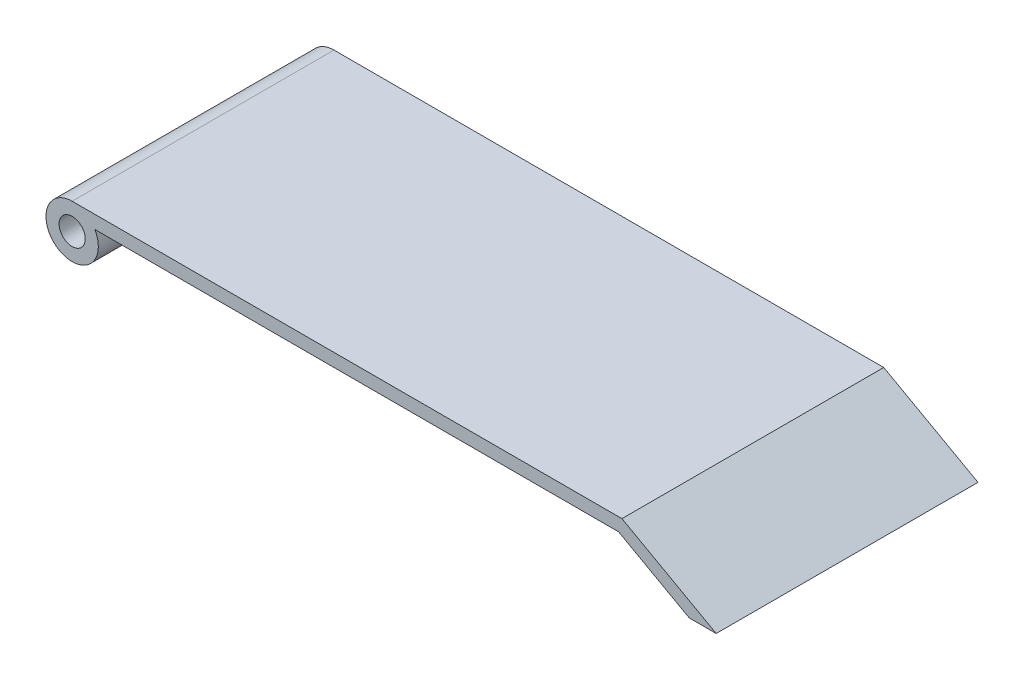
ISO-10303-21;
HEADER;
FILE_DESCRIPTION(('STEP AP214'),'2;1');
FILE_NAME('part.step','',(''),(''),'','','');
FILE_SCHEMA(('AUTOMOTIVE_DESIGN { 1 0 10303 214 1 1 1 1 }'));
ENDSEC;
DATA;
#1=APPLICATION_CONTEXT('core data for automotive mechanical design processes');
#2=APPLICATION_PROTOCOL_DEFINITION('international standard','automotive_design',2000,#1);
#3=PRODUCT_CONTEXT('',#1,'mechanical');
#4=PRODUCT('Part','Part','',(#3));
#5=PRODUCT_RELATED_PRODUCT_CATEGORY('part','',(#4));
#6=PRODUCT_DEFINITION_FORMATION('','',#4);
#7=PRODUCT_DEFINITION_CONTEXT('part definition',#1,'design');
#8=PRODUCT_DEFINITION('design','',#6,#7);
#9=PRODUCT_DEFINITION_SHAPE('','',#8);
#10=(LENGTH_UNIT() NAMED_UNIT(*) SI_UNIT(.MILLI.,.METRE.));
#11=(NAMED_UNIT(*) PLANE_ANGLE_UNIT() SI_UNIT($,.RADIAN.));
#12=(NAMED_UNIT(*) SI_UNIT($,.STERADIAN.) SOLID_ANGLE_UNIT());
#13=UNCERTAINTY_MEASURE_WITH_UNIT(LENGTH_MEASURE(1.E-05),#10,'distance_accuracy_value','');
#14=(GEOMETRIC_REPRESENTATION_CONTEXT(3) GLOBAL_UNCERTAINTY_ASSIGNED_CONTEXT((#13)) GLOBAL_UNIT_ASSIGNED_CONTEXT((#10,
#11,#12)) REPRESENTATION_CONTEXT('',''));
#15=CARTESIAN_POINT('',(0.,0.,0.));
#16=DIRECTION('',(0.,0.,1.));
#17=DIRECTION('',(1.,0.,0.));
#18=AXIS2_PLACEMENT_3D('',#15,#16,#17);
#19=CARTESIAN_POINT('',(10.3363442521382,-10.,10.));
#20=DIRECTION('',(0.,0.,1.));
#21=DIRECTION('',(1.,0.,0.));
#22=AXIS2_PLACEMENT_3D('',#19,#20,#21);
#23=PLANE('',#22);
#24=CARTESIAN_POINT('',(10.3363442521382,-10.,10.));
#25=DIRECTION('',(0.,0.,-1.));
#26=DIRECTION('',(1.,0.,0.));
#27=AXIS2_PLACEMENT_3D('',#24,#25,#26);
#28=CIRCLE('',#27,2.4);
#29=CARTESIAN_POINT('',(7.93634425213825,-10.,10.));
#30=VERTEX_POINT('',#29);
#31=EDGE_CURVE('P0_E21',#30,#30,#28,.T.);
#32=ORIENTED_EDGE('',*,*,#31,.F.);
#33=EDGE_LOOP('',(#32));
#34=FACE_BOUND('',#33,.T.);
#35=ADVANCED_FACE('P0_F17',(#34),#23,.T.);
#36=CARTESIAN_POINT('',(10.3363442521382,-10.,0.));
#37=DIRECTION('',(0.,0.,1.));
#38=DIRECTION('',(1.,0.,0.));
#39=AXIS2_PLACEMENT_3D('',#36,#37,#38);
#40=PLANE('',#39);
#41=CARTESIAN_POINT('',(10.3363442521382,-10.,0.));
#42=DIRECTION('',(0.,0.,1.));
#43=DIRECTION('',(1.,0.,0.));
#44=AXIS2_PLACEMENT_3D('',#41,#42,#43);
#45=CIRCLE('',#44,2.4);
#46=CARTESIAN_POINT('',(7.93634425213825,-10.,0.));
#47=VERTEX_POINT('',#46);
#48=EDGE_CURVE('P0_E11',#47,#47,#45,.T.);
#49=ORIENTED_EDGE('',*,*,#48,.F.);
#50=EDGE_LOOP('',(#49));
#51=FACE_BOUND('',#50,.T.);
#52=ADVANCED_FACE('P0_F19',(#51),#40,.F.);
#53=CARTESIAN_POINT('',(10.3363442521382,-10.,0.));
#54=DIRECTION('',(0.,0.,1.));
#55=DIRECTION('',(1.,0.,0.));
#56=AXIS2_PLACEMENT_3D('',#53,#54,#55);
#57=CYLINDRICAL_SURFACE('',#56,2.4);
#58=ORIENTED_EDGE('',*,*,#48,.T.);
#59=EDGE_LOOP('',(#58));
#60=FACE_BOUND('',#59,.T.);
#61=ORIENTED_EDGE('',*,*,#31,.T.);
#62=EDGE_LOOP('',(#61));
#63=FACE_BOUND('',#62,.T.);
#64=ADVANCED_FACE('P0_F40',(#60,#63),#57,.T.);
#65=CLOSED_SHELL('',(#35,#52,#64));
#66=MANIFOLD_SOLID_BREP('P0_B1',#65);
#67=CARTESIAN_POINT('',(59.,0.,50.));
#68=DIRECTION('',(0.,0.,1.));
#69=DIRECTION('',(1.,0.,0.));
#70=AXIS2_PLACEMENT_3D('',#67,#68,#69);
#71=PLANE('',#70);
#72=CARTESIAN_POINT('',(0.,0.,50.));
#73=DIRECTION('',(0.,0.,-1.));
#74=DIRECTION('',(-1.,0.,0.));
#75=AXIS2_PLACEMENT_3D('',#72,#73,#74);
#76=CIRCLE('',#75,2.5);
#77=CARTESIAN_POINT('',(2.5,0.,50.));
#78=VERTEX_POINT('',#77);
#79=EDGE_CURVE('P1_E10',#78,#78,#76,.T.);
#80=ORIENTED_EDGE('',*,*,#79,.T.);
#81=EDGE_LOOP('',(#80));
#82=FACE_BOUND('',#81,.T.);
#83=DIRECTION('',(0.87415727612154,-0.485642931178628,0.));
#84=VECTOR('',#83,1.);
#85=CARTESIAN_POINT('',(104.352184929506,2.5,50.));
#86=LINE('',#85,#84);
#87=CARTESIAN_POINT('',(104.352184929506,2.5,50.));
#88=VERTEX_POINT('',#87);
#89=CARTESIAN_POINT('',(117.852184929507,-5.,50.));
#90=VERTEX_POINT('',#89);
#91=EDGE_CURVE('P1_E216',#88,#90,#86,.T.);
#92=ORIENTED_EDGE('',*,*,#91,.T.);
#93=DIRECTION('',(-1.,0.,0.));
#94=VECTOR('',#93,1.);
#95=CARTESIAN_POINT('',(123.,-5.,50.));
#96=LINE('',#95,#94);
#97=CARTESIAN_POINT('',(123.,-5.,50.));
#98=VERTEX_POINT('',#97);
#99=EDGE_CURVE('P1_E241',#98,#90,#96,.T.);
#100=ORIENTED_EDGE('',*,*,#99,.F.);
#101=DIRECTION('',(-0.874157276121538,0.485642931178632,0.));
#102=VECTOR('',#101,1.);
#103=CARTESIAN_POINT('',(123.,-5.,50.));
#104=LINE('',#103,#102);
#105=CARTESIAN_POINT('',(105.,5.,50.));
#106=VERTEX_POINT('',#105);
#107=EDGE_CURVE('P1_E180',#98,#106,#104,.T.);
#108=ORIENTED_EDGE('',*,*,#107,.T.);
#109=DIRECTION('',(1.,0.,0.));
#110=VECTOR('',#109,1.);
#111=CARTESIAN_POINT('',(0.,5.,50.));
#112=LINE('',#111,#110);
#113=CARTESIAN_POINT('',(0.,5.,50.));
#114=VERTEX_POINT('',#113);
#115=EDGE_CURVE('P1_E177',#114,#106,#112,.T.);
#116=ORIENTED_EDGE('',*,*,#115,.F.);
#117=CARTESIAN_POINT('',(0.,0.,50.));
#118=DIRECTION('',(0.,0.,-1.));
#119=DIRECTION('',(-0.707106781186548,0.707106781186548,0.));
#120=AXIS2_PLACEMENT_3D('',#117,#118,#119);
#121=CIRCLE('',#120,5.);
#122=CARTESIAN_POINT('',(4.3301270189222,2.5,50.));
#123=VERTEX_POINT('',#122);
#124=EDGE_CURVE('P1_E162',#123,#114,#121,.T.);
#125=ORIENTED_EDGE('',*,*,#124,.F.);
#126=DIRECTION('',(1.,0.,0.));
#127=VECTOR('',#126,1.);
#128=CARTESIAN_POINT('',(4.3301270189222,2.5,50.));
#129=LINE('',#128,#127);
#130=EDGE_CURVE('P1_E231',#123,#88,#129,.T.);
#131=ORIENTED_EDGE('',*,*,#130,.T.);
#132=EDGE_LOOP('',(#92,#100,#108,#116,#125,#131));
#133=FACE_BOUND('',#132,.T.);
#134=ADVANCED_FACE('P1_F16',(#82,#133),#71,.T.);
#135=CARTESIAN_POINT('',(0.,0.,0.));
#136=DIRECTION('',(0.,0.,1.));
#137=DIRECTION('',(-1.,0.,0.));
#138=AXIS2_PLACEMENT_3D('',#135,#136,#137);
#139=CYLINDRICAL_SURFACE('',#138,2.5);
#140=CARTESIAN_POINT('',(0.,0.,0.));
#141=DIRECTION('',(0.,0.,1.));
#142=DIRECTION('',(-1.,0.,0.));
#143=AXIS2_PLACEMENT_3D('',#140,#141,#142);
#144=CIRCLE('',#143,2.5);
#145=CARTESIAN_POINT('',(2.5,0.,0.));
#146=VERTEX_POINT('',#145);
#147=EDGE_CURVE('P1_E287',#146,#146,#144,.T.);
#148=ORIENTED_EDGE('',*,*,#147,.F.);
#149=EDGE_LOOP('',(#148));
#150=FACE_BOUND('',#149,.T.);
#151=ORIENTED_EDGE('',*,*,#79,.F.);
#152=EDGE_LOOP('',(#151));
#153=FACE_BOUND('',#152,.T.);
#154=ADVANCED_FACE('P1_F371',(#150,#153),#139,.F.);
#155=CARTESIAN_POINT('',(10.3363442521382,-10.,5.));
#156=DIRECTION('',(0.,0.,1.));
#157=DIRECTION('',(1.,0.,0.));
#158=AXIS2_PLACEMENT_3D('',#155,#156,#157);
#159=PLANE('',#158);
#160=CARTESIAN_POINT('',(10.3363442521382,-10.,5.));
#161=DIRECTION('',(0.,0.,-1.));
#162=DIRECTION('',(1.,0.,0.));
#163=AXIS2_PLACEMENT_3D('',#160,#161,#162);
#164=CIRCLE('',#163,2.5);
#165=CARTESIAN_POINT('',(7.83634425213825,-10.,5.));
#166=VERTEX_POINT('',#165);
#167=EDGE_CURVE('P1_E203',#166,#166,#164,.T.);
#168=ORIENTED_EDGE('',*,*,#167,.T.);
#169=EDGE_LOOP('',(#168));
#170=FACE_BOUND('',#169,.T.);
#171=CARTESIAN_POINT('',(10.3363442521382,-10.,5.));
#172=DIRECTION('',(0.,0.,-1.));
#173=DIRECTION('',(-0.707106781186548,-0.707106781186547,0.));
#174=AXIS2_PLACEMENT_3D('',#171,#172,#173);
#175=CIRCLE('',#174,5.);
#176=CARTESIAN_POINT('',(15.3363442521383,-10.,5.));
#177=VERTEX_POINT('',#176);
#178=CARTESIAN_POINT('',(5.33634425213825,-10.,5.));
#179=VERTEX_POINT('',#178);
#180=EDGE_CURVE('P1_E173',#177,#179,#175,.T.);
#181=ORIENTED_EDGE('',*,*,#180,.F.);
#182=DIRECTION('',(0.,-1.,0.));
#183=VECTOR('',#182,1.);
#184=CARTESIAN_POINT('',(15.3363442521383,2.5,5.));
#185=LINE('',#184,#183);
#186=CARTESIAN_POINT('',(15.3363442521383,2.5,5.));
#187=VERTEX_POINT('',#186);
#188=EDGE_CURVE('P1_E20',#187,#177,#185,.T.);
#189=ORIENTED_EDGE('',*,*,#188,.F.);
#190=DIRECTION('',(1.,0.,0.));
#191=VECTOR('',#190,1.);
#192=CARTESIAN_POINT('',(5.33634425213824,2.5,5.));
#193=LINE('',#192,#191);
#194=CARTESIAN_POINT('',(5.33634425213824,2.5,5.));
#195=VERTEX_POINT('',#194);
#196=EDGE_CURVE('P1_E244',#195,#187,#193,.T.);
#197=ORIENTED_EDGE('',*,*,#196,.F.);
#198=DIRECTION('',(0.,1.,0.));
#199=VECTOR('',#198,1.);
#200=CARTESIAN_POINT('',(5.33634425213825,-10.,5.));
#201=LINE('',#200,#199);
#202=EDGE_CURVE('P1_E27',#179,#195,#201,.T.);
#203=ORIENTED_EDGE('',*,*,#202,.F.);
#204=EDGE_LOOP('',(#181,#189,#197,#203));
#205=FACE_BOUND('',#204,.T.);
#206=ADVANCED_FACE('P1_F18',(#170,#205),#159,.T.);
#207=CARTESIAN_POINT('',(5.33634425213825,-15.,0.));
#208=DIRECTION('',(-1.,0.,0.));
#209=DIRECTION('',(0.,0.,1.));
#210=AXIS2_PLACEMENT_3D('',#207,#208,#209);
#211=PLANE('',#210);
#212=DIRECTION('',(0.,0.,-1.));
#213=VECTOR('',#212,1.);
#214=CARTESIAN_POINT('',(5.33634425213825,-10.,5.));
#215=LINE('',#214,#213);
#216=CARTESIAN_POINT('',(5.33634425213825,-10.,0.));
#217=VERTEX_POINT('',#216);
#218=EDGE_CURVE('P1_E303',#179,#217,#215,.T.);
#219=ORIENTED_EDGE('',*,*,#218,.F.);
#220=ORIENTED_EDGE('',*,*,#202,.T.);
#221=DIRECTION('',(0.,0.,1.));
#222=VECTOR('',#221,1.);
#223=CARTESIAN_POINT('',(5.33634425213824,2.5,2.5));
#224=LINE('',#223,#222);
#225=CARTESIAN_POINT('',(5.33634425213824,2.5,2.5));
#226=VERTEX_POINT('',#225);
#227=EDGE_CURVE('P1_E230',#226,#195,#224,.T.);
#228=ORIENTED_EDGE('',*,*,#227,.F.);
#229=DIRECTION('',(0.,1.,0.));
#230=VECTOR('',#229,1.);
#231=CARTESIAN_POINT('',(5.33634425213824,-5.,2.5));
#232=LINE('',#231,#230);
#233=CARTESIAN_POINT('',(5.33634425213824,-5.,2.5));
#234=VERTEX_POINT('',#233);
#235=EDGE_CURVE('P1_E270',#234,#226,#232,.T.);
#236=ORIENTED_EDGE('',*,*,#235,.F.);
#237=DIRECTION('',(0.,0.,1.));
#238=VECTOR('',#237,1.);
#239=CARTESIAN_POINT('',(5.33634425213824,-5.,0.));
#240=LINE('',#239,#238);
#241=CARTESIAN_POINT('',(5.33634425213824,-5.,0.));
#242=VERTEX_POINT('',#241);
#243=EDGE_CURVE('P1_E205',#242,#234,#240,.T.);
#244=ORIENTED_EDGE('',*,*,#243,.F.);
#245=DIRECTION('',(0.,1.,0.));
#246=VECTOR('',#245,1.);
#247=CARTESIAN_POINT('',(5.33634425213825,-10.,0.));
#248=LINE('',#247,#246);
#249=EDGE_CURVE('P1_E262',#217,#242,#248,.T.);
#250=ORIENTED_EDGE('',*,*,#249,.F.);
#251=EDGE_LOOP('',(#219,#220,#228,#236,#244,#250));
#252=FACE_BOUND('',#251,.T.);
#253=ADVANCED_FACE('P1_F326',(#252),#211,.T.);
#254=CARTESIAN_POINT('',(10.3363442521382,-10.,0.));
#255=DIRECTION('',(0.,0.,1.));
#256=DIRECTION('',(1.,0.,0.));
#257=AXIS2_PLACEMENT_3D('',#254,#255,#256);
#258=CYLINDRICAL_SURFACE('',#257,2.5);
#259=CARTESIAN_POINT('',(10.3363442521382,-10.,0.));
#260=DIRECTION('',(0.,0.,1.));
#261=DIRECTION('',(1.,0.,0.));
#262=AXIS2_PLACEMENT_3D('',#259,#260,#261);
#263=CIRCLE('',#262,2.5);
#264=CARTESIAN_POINT('',(7.83634425213825,-10.,0.));
#265=VERTEX_POINT('',#264);
#266=EDGE_CURVE('P1_E174',#265,#265,#263,.T.);
#267=ORIENTED_EDGE('',*,*,#266,.F.);
#268=EDGE_LOOP('',(#267));
#269=FACE_BOUND('',#268,.T.);
#270=ORIENTED_EDGE('',*,*,#167,.F.);
#271=EDGE_LOOP('',(#270));
#272=FACE_BOUND('',#271,.T.);
#273=ADVANCED_FACE('P1_F489',(#269,#272),#258,.F.);
#274=CARTESIAN_POINT('',(105.,5.,50.));
#275=DIRECTION('',(-0.485642931178631,-0.874157276121538,0.));
#276=DIRECTION('',(-0.874157276121538,0.485642931178631,0.));
#277=AXIS2_PLACEMENT_3D('',#274,#275,#276);
#278=PLANE('',#277);
#279=DIRECTION('',(0.874157276121538,-0.485642931178632,0.));
#280=VECTOR('',#279,1.);
#281=CARTESIAN_POINT('',(105.,5.,0.));
#282=LINE('',#281,#280);
#283=CARTESIAN_POINT('',(105.,5.,0.));
#284=VERTEX_POINT('',#283);
#285=CARTESIAN_POINT('',(123.,-5.,0.));
#286=VERTEX_POINT('',#285);
#287=EDGE_CURVE('P1_E222',#284,#286,#282,.T.);
#288=ORIENTED_EDGE('',*,*,#287,.F.);
#289=DIRECTION('',(0.,0.,-1.));
#290=VECTOR('',#289,1.);
#291=CARTESIAN_POINT('',(105.,5.,50.));
#292=LINE('',#291,#290);
#293=EDGE_CURVE('P1_E185',#106,#284,#292,.T.);
#294=ORIENTED_EDGE('',*,*,#293,.F.);
#295=ORIENTED_EDGE('',*,*,#107,.F.);
#296=DIRECTION('',(0.,0.,1.));
#297=VECTOR('',#296,1.);
#298=CARTESIAN_POINT('',(123.,-5.,0.));
#299=LINE('',#298,#297);
#300=EDGE_CURVE('P1_E238',#286,#98,#299,.T.);
#301=ORIENTED_EDGE('',*,*,#300,.F.);
#302=EDGE_LOOP('',(#288,#294,#295,#301));
#303=FACE_BOUND('',#302,.T.);
#304=ADVANCED_FACE('P1_F497',(#303),#278,.F.);
#305=CARTESIAN_POINT('',(15.3363442521383,-5.,0.));
#306=DIRECTION('',(1.,0.,0.));
#307=DIRECTION('',(0.,1.,0.));
#308=AXIS2_PLACEMENT_3D('',#305,#306,#307);
#309=PLANE('',#308);
#310=DIRECTION('',(0.,0.,1.));
#311=VECTOR('',#310,1.);
#312=CARTESIAN_POINT('',(15.3363442521383,-10.,0.));
#313=LINE('',#312,#311);
#314=CARTESIAN_POINT('',(15.3363442521383,-10.,0.));
#315=VERTEX_POINT('',#314);
#316=EDGE_CURVE('P1_E299',#315,#177,#313,.T.);
#317=ORIENTED_EDGE('',*,*,#316,.F.);
#318=DIRECTION('',(0.,-1.,0.));
#319=VECTOR('',#318,1.);
#320=CARTESIAN_POINT('',(15.3363442521383,-5.,0.));
#321=LINE('',#320,#319);
#322=CARTESIAN_POINT('',(15.3363442521383,-5.,0.));
#323=VERTEX_POINT('',#322);
#324=EDGE_CURVE('P1_E217',#323,#315,#321,.T.);
#325=ORIENTED_EDGE('',*,*,#324,.F.);
#326=DIRECTION('',(0.,0.,-1.));
#327=VECTOR('',#326,1.);
#328=CARTESIAN_POINT('',(15.3363442521383,-5.,2.5));
#329=LINE('',#328,#327);
#330=CARTESIAN_POINT('',(15.3363442521383,-5.,2.5));
#331=VERTEX_POINT('',#330);
#332=EDGE_CURVE('P1_E208',#331,#323,#329,.T.);
#333=ORIENTED_EDGE('',*,*,#332,.F.);
#334=DIRECTION('',(0.,-1.,0.));
#335=VECTOR('',#334,1.);
#336=CARTESIAN_POINT('',(15.3363442521383,2.5,2.5));
#337=LINE('',#336,#335);
#338=CARTESIAN_POINT('',(15.3363442521383,2.5,2.5));
#339=VERTEX_POINT('',#338);
#340=EDGE_CURVE('P1_E126',#339,#331,#337,.T.);
#341=ORIENTED_EDGE('',*,*,#340,.F.);
#342=DIRECTION('',(0.,0.,-1.));
#343=VECTOR('',#342,1.);
#344=CARTESIAN_POINT('',(15.3363442521383,2.5,5.));
#345=LINE('',#344,#343);
#346=EDGE_CURVE('P1_E223',#187,#339,#345,.T.);
#347=ORIENTED_EDGE('',*,*,#346,.F.);
#348=ORIENTED_EDGE('',*,*,#188,.T.);
#349=EDGE_LOOP('',(#317,#325,#333,#341,#347,#348));
#350=FACE_BOUND('',#349,.T.);
#351=ADVANCED_FACE('P1_F334',(#350),#309,.T.);
#352=CARTESIAN_POINT('',(10.3363442521382,-10.,0.));
#353=DIRECTION('',(0.,0.,1.));
#354=DIRECTION('',(0.707106781186548,-0.707106781186548,0.));
#355=AXIS2_PLACEMENT_3D('',#352,#353,#354);
#356=CYLINDRICAL_SURFACE('',#355,5.);
#357=ORIENTED_EDGE('',*,*,#180,.T.);
#358=ORIENTED_EDGE('',*,*,#218,.T.);
#359=CARTESIAN_POINT('',(10.3363442521382,-10.,0.));
#360=DIRECTION('',(0.,0.,1.));
#361=DIRECTION('',(-0.707106781186548,-0.707106781186547,0.));
#362=AXIS2_PLACEMENT_3D('',#359,#360,#361);
#363=CIRCLE('',#362,5.);
#364=EDGE_CURVE('P1_E221',#217,#315,#363,.T.);
#365=ORIENTED_EDGE('',*,*,#364,.T.);
#366=ORIENTED_EDGE('',*,*,#316,.T.);
#367=EDGE_LOOP('',(#357,#358,#365,#366));
#368=FACE_BOUND('',#367,.T.);
#369=ADVANCED_FACE('P1_F322',(#368),#356,.T.);
#370=CARTESIAN_POINT('',(0.,0.,0.));
#371=DIRECTION('',(0.,0.,1.));
#372=DIRECTION('',(-0.707106781186548,0.707106781186548,0.));
#373=AXIS2_PLACEMENT_3D('',#370,#371,#372);
#374=CYLINDRICAL_SURFACE('',#373,5.);
#375=ORIENTED_EDGE('',*,*,#124,.T.);
#376=DIRECTION('',(0.,0.,-1.));
#377=VECTOR('',#376,1.);
#378=CARTESIAN_POINT('',(0.,5.,50.));
#379=LINE('',#378,#377);
#380=CARTESIAN_POINT('',(0.,5.,0.));
#381=VERTEX_POINT('',#380);
#382=EDGE_CURVE('P1_E166',#114,#381,#379,.T.);
#383=ORIENTED_EDGE('',*,*,#382,.T.);
#384=CARTESIAN_POINT('',(0.,0.,0.));
#385=DIRECTION('',(0.,0.,1.));
#386=DIRECTION('',(-0.707106781186548,0.707106781186548,0.));
#387=AXIS2_PLACEMENT_3D('',#384,#385,#386);
#388=CIRCLE('',#387,5.);
#389=CARTESIAN_POINT('',(0.,-5.,0.));
#390=VERTEX_POINT('',#389);
#391=EDGE_CURVE('P1_E266',#381,#390,#388,.T.);
#392=ORIENTED_EDGE('',*,*,#391,.T.);
#393=DIRECTION('',(0.,0.,1.));
#394=VECTOR('',#393,1.);
#395=CARTESIAN_POINT('',(0.,-5.,0.));
#396=LINE('',#395,#394);
#397=CARTESIAN_POINT('',(0.,-5.,2.5));
#398=VERTEX_POINT('',#397);
#399=EDGE_CURVE('P1_E210',#390,#398,#396,.T.);
#400=ORIENTED_EDGE('',*,*,#399,.T.);
#401=CARTESIAN_POINT('',(0.,0.,2.5));
#402=DIRECTION('',(0.,0.,-1.));
#403=DIRECTION('',(0.,1.,0.));
#404=AXIS2_PLACEMENT_3D('',#401,#402,#403);
#405=CIRCLE('',#404,5.);
#406=CARTESIAN_POINT('',(4.3301270189222,2.5,2.5));
#407=VERTEX_POINT('',#406);
#408=EDGE_CURVE('P1_E199',#407,#398,#405,.T.);
#409=ORIENTED_EDGE('',*,*,#408,.F.);
#410=DIRECTION('',(0.,0.,-1.));
#411=VECTOR('',#410,1.);
#412=CARTESIAN_POINT('',(4.3301270189222,2.5,50.));
#413=LINE('',#412,#411);
#414=EDGE_CURVE('P1_E168',#123,#407,#413,.T.);
#415=ORIENTED_EDGE('',*,*,#414,.F.);
#416=EDGE_LOOP('',(#375,#383,#392,#400,#409,#415));
#417=FACE_BOUND('',#416,.T.);
#418=ADVANCED_FACE('P1_F164',(#417),#374,.T.);
#419=CARTESIAN_POINT('',(59.,0.,0.));
#420=DIRECTION('',(0.,0.,1.));
#421=DIRECTION('',(1.,0.,0.));
#422=AXIS2_PLACEMENT_3D('',#419,#420,#421);
#423=PLANE('',#422);
#424=ORIENTED_EDGE('',*,*,#266,.T.);
#425=EDGE_LOOP('',(#424));
#426=FACE_BOUND('',#425,.T.);
#427=ORIENTED_EDGE('',*,*,#147,.T.);
#428=EDGE_LOOP('',(#427));
#429=FACE_BOUND('',#428,.T.);
#430=ORIENTED_EDGE('',*,*,#391,.F.);
#431=DIRECTION('',(1.,0.,0.));
#432=VECTOR('',#431,1.);
#433=CARTESIAN_POINT('',(0.,5.,0.));
#434=LINE('',#433,#432);
#435=EDGE_CURVE('P1_E190',#381,#284,#434,.T.);
#436=ORIENTED_EDGE('',*,*,#435,.T.);
#437=ORIENTED_EDGE('',*,*,#287,.T.);
#438=DIRECTION('',(-1.,0.,0.));
#439=VECTOR('',#438,1.);
#440=CARTESIAN_POINT('',(123.,-5.,0.));
#441=LINE('',#440,#439);
#442=EDGE_CURVE('P1_E234',#286,#323,#441,.T.);
#443=ORIENTED_EDGE('',*,*,#442,.T.);
#444=ORIENTED_EDGE('',*,*,#324,.T.);
#445=ORIENTED_EDGE('',*,*,#364,.F.);
#446=ORIENTED_EDGE('',*,*,#249,.T.);
#447=DIRECTION('',(-1.,0.,0.));
#448=VECTOR('',#447,1.);
#449=CARTESIAN_POINT('',(5.33634425213824,-5.,0.));
#450=LINE('',#449,#448);
#451=EDGE_CURVE('P1_E209',#242,#390,#450,.T.);
#452=ORIENTED_EDGE('',*,*,#451,.T.);
#453=EDGE_LOOP('',(#430,#436,#437,#443,#444,#445,#446,#452));
#454=FACE_BOUND('',#453,.T.);
#455=ADVANCED_FACE('P1_F332',(#426,#429,#454),#423,.F.);
#456=CARTESIAN_POINT('',(123.,-5.,0.));
#457=DIRECTION('',(0.,-1.,0.));
#458=DIRECTION('',(0.,0.,-1.));
#459=AXIS2_PLACEMENT_3D('',#456,#457,#458);
#460=PLANE('',#459);
#461=DIRECTION('',(0.,0.,-1.));
#462=VECTOR('',#461,1.);
#463=CARTESIAN_POINT('',(117.852184929507,-5.,50.));
#464=LINE('',#463,#462);
#465=CARTESIAN_POINT('',(117.852184929507,-5.,2.5));
#466=VERTEX_POINT('',#465);
#467=EDGE_CURVE('P1_E255',#90,#466,#464,.T.);
#468=ORIENTED_EDGE('',*,*,#467,.T.);
#469=DIRECTION('',(-1.,0.,0.));
#470=VECTOR('',#469,1.);
#471=CARTESIAN_POINT('',(117.852184929507,-5.,2.5));
#472=LINE('',#471,#470);
#473=EDGE_CURVE('P1_E213',#466,#331,#472,.T.);
#474=ORIENTED_EDGE('',*,*,#473,.T.);
#475=ORIENTED_EDGE('',*,*,#332,.T.);
#476=ORIENTED_EDGE('',*,*,#442,.F.);
#477=ORIENTED_EDGE('',*,*,#300,.T.);
#478=ORIENTED_EDGE('',*,*,#99,.T.);
#479=EDGE_LOOP('',(#468,#474,#475,#476,#477,#478));
#480=FACE_BOUND('',#479,.T.);
#481=ADVANCED_FACE('P1_F347',(#480),#460,.T.);
#482=CARTESIAN_POINT('',(123.,-5.,0.));
#483=DIRECTION('',(0.,-1.,0.));
#484=DIRECTION('',(0.,0.,-1.));
#485=AXIS2_PLACEMENT_3D('',#482,#483,#484);
#486=PLANE('',#485);
#487=DIRECTION('',(-1.,0.,0.));
#488=VECTOR('',#487,1.);
#489=CARTESIAN_POINT('',(5.33634425213824,-5.,2.5));
#490=LINE('',#489,#488);
#491=EDGE_CURVE('P1_E192',#234,#398,#490,.T.);
#492=ORIENTED_EDGE('',*,*,#491,.T.);
#493=ORIENTED_EDGE('',*,*,#399,.F.);
#494=ORIENTED_EDGE('',*,*,#451,.F.);
#495=ORIENTED_EDGE('',*,*,#243,.T.);
#496=EDGE_LOOP('',(#492,#493,#494,#495));
#497=FACE_BOUND('',#496,.T.);
#498=ADVANCED_FACE('P1_F381',(#497),#486,.T.);
#499=CARTESIAN_POINT('',(57.9668171024684,-1.55589237762561,2.5));
#500=DIRECTION('',(0.,0.,1.));
#501=DIRECTION('',(1.,0.,0.));
#502=AXIS2_PLACEMENT_3D('',#499,#500,#501);
#503=PLANE('',#502);
#504=ORIENTED_EDGE('',*,*,#340,.T.);
#505=ORIENTED_EDGE('',*,*,#473,.F.);
#506=DIRECTION('',(-0.87415727612154,0.485642931178628,0.));
#507=VECTOR('',#506,1.);
#508=CARTESIAN_POINT('',(117.852184929507,-5.,2.5));
#509=LINE('',#508,#507);
#510=CARTESIAN_POINT('',(104.352184929506,2.5,2.5));
#511=VERTEX_POINT('',#510);
#512=EDGE_CURVE('P1_E250',#466,#511,#509,.T.);
#513=ORIENTED_EDGE('',*,*,#512,.T.);
#514=DIRECTION('',(-1.,0.,0.));
#515=VECTOR('',#514,1.);
#516=CARTESIAN_POINT('',(104.352184929506,2.5,2.5));
#517=LINE('',#516,#515);
#518=EDGE_CURVE('P1_E227',#511,#339,#517,.T.);
#519=ORIENTED_EDGE('',*,*,#518,.T.);
#520=EDGE_LOOP('',(#504,#505,#513,#519));
#521=FACE_BOUND('',#520,.T.);
#522=ADVANCED_FACE('P1_F356',(#521),#503,.T.);
#523=CARTESIAN_POINT('',(117.852184929507,-5.,50.));
#524=DIRECTION('',(0.485642931178628,0.87415727612154,0.));
#525=DIRECTION('',(0.,0.,-1.));
#526=AXIS2_PLACEMENT_3D('',#523,#524,#525);
#527=PLANE('',#526);
#528=ORIENTED_EDGE('',*,*,#512,.F.);
#529=ORIENTED_EDGE('',*,*,#467,.F.);
#530=ORIENTED_EDGE('',*,*,#91,.F.);
#531=DIRECTION('',(0.,0.,-1.));
#532=VECTOR('',#531,1.);
#533=CARTESIAN_POINT('',(104.352184929506,2.5,50.));
#534=LINE('',#533,#532);
#535=EDGE_CURVE('P1_E278',#88,#511,#534,.T.);
#536=ORIENTED_EDGE('',*,*,#535,.T.);
#537=EDGE_LOOP('',(#528,#529,#530,#536));
#538=FACE_BOUND('',#537,.T.);
#539=ADVANCED_FACE('P1_F353',(#538),#527,.F.);
#540=CARTESIAN_POINT('',(104.352184929506,2.5,50.));
#541=DIRECTION('',(0.,1.,0.));
#542=DIRECTION('',(1.,0.,0.));
#543=AXIS2_PLACEMENT_3D('',#540,#541,#542);
#544=PLANE('',#543);
#545=ORIENTED_EDGE('',*,*,#346,.T.);
#546=ORIENTED_EDGE('',*,*,#518,.F.);
#547=ORIENTED_EDGE('',*,*,#535,.F.);
#548=ORIENTED_EDGE('',*,*,#130,.F.);
#549=ORIENTED_EDGE('',*,*,#414,.T.);
#550=DIRECTION('',(-1.,0.,0.));
#551=VECTOR('',#550,1.);
#552=CARTESIAN_POINT('',(5.33634425213824,2.5,2.5));
#553=LINE('',#552,#551);
#554=EDGE_CURVE('P1_E267',#226,#407,#553,.T.);
#555=ORIENTED_EDGE('',*,*,#554,.F.);
#556=ORIENTED_EDGE('',*,*,#227,.T.);
#557=ORIENTED_EDGE('',*,*,#196,.T.);
#558=EDGE_LOOP('',(#545,#546,#547,#548,#549,#555,#556,#557));
#559=FACE_BOUND('',#558,.T.);
#560=ADVANCED_FACE('P1_F357',(#559),#544,.F.);
#561=CARTESIAN_POINT('',(-5.,5.,0.));
#562=DIRECTION('',(0.,1.,0.));
#563=DIRECTION('',(1.,0.,0.));
#564=AXIS2_PLACEMENT_3D('',#561,#562,#563);
#565=PLANE('',#564);
#566=ORIENTED_EDGE('',*,*,#382,.F.);
#567=ORIENTED_EDGE('',*,*,#115,.T.);
#568=ORIENTED_EDGE('',*,*,#293,.T.);
#569=ORIENTED_EDGE('',*,*,#435,.F.);
#570=EDGE_LOOP('',(#566,#567,#568,#569));
#571=FACE_BOUND('',#570,.T.);
#572=ADVANCED_FACE('P1_F188',(#571),#565,.T.);
#573=CARTESIAN_POINT('',(57.9668171024684,-1.55589237762561,2.5));
#574=DIRECTION('',(0.,0.,1.));
#575=DIRECTION('',(1.,0.,0.));
#576=AXIS2_PLACEMENT_3D('',#573,#574,#575);
#577=PLANE('',#576);
#578=ORIENTED_EDGE('',*,*,#235,.T.);
#579=ORIENTED_EDGE('',*,*,#554,.T.);
#580=ORIENTED_EDGE('',*,*,#408,.T.);
#581=ORIENTED_EDGE('',*,*,#491,.F.);
#582=EDGE_LOOP('',(#578,#579,#580,#581));
#583=FACE_BOUND('',#582,.T.);
#584=ADVANCED_FACE('P1_F365',(#583),#577,.T.);
#585=CLOSED_SHELL('',(#134,#154,#206,#253,#273,#304,#351,#369,#418,#455,#481,#498,#522,#539,
#560,#572,#584));
#586=MANIFOLD_SOLID_BREP('P1_B1',#585);
#587=ADVANCED_BREP_SHAPE_REPRESENTATION('',(#18,#66,#586),#14);
#588=SHAPE_DEFINITION_REPRESENTATION(#9,#587);
ENDSEC;
END-ISO-10303-21;
